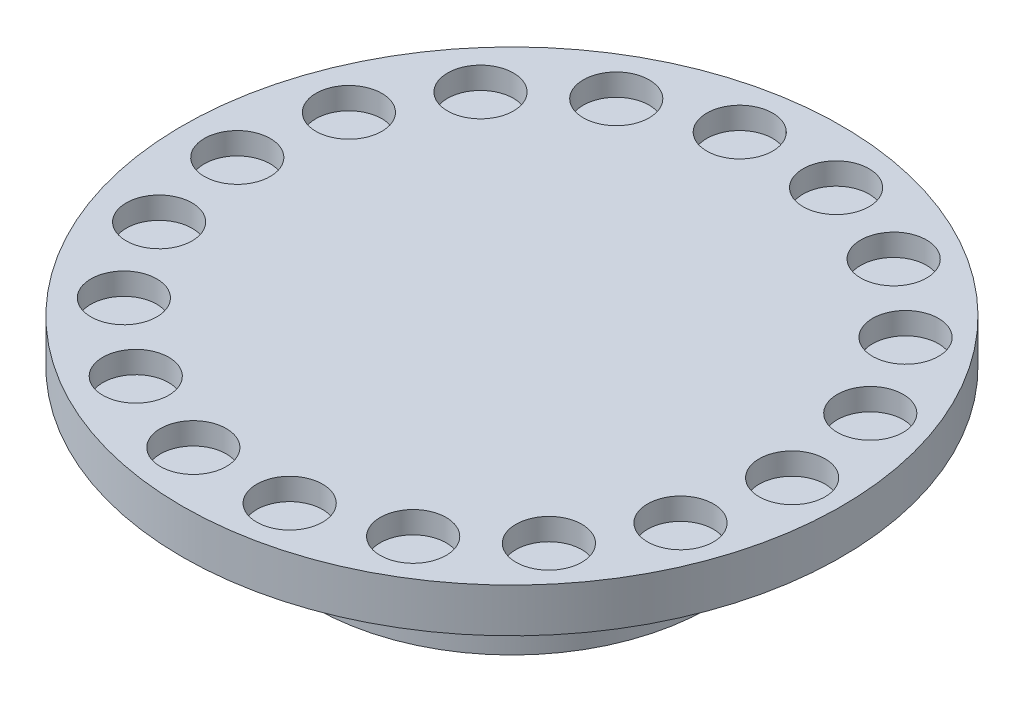
ISO-10303-21;
HEADER;
FILE_DESCRIPTION(('STEP AP214'),'2;1');
FILE_NAME('part.step','',(''),(''),'','','');
FILE_SCHEMA(('AUTOMOTIVE_DESIGN { 1 0 10303 214 1 1 1 1 }'));
ENDSEC;
DATA;
#1=APPLICATION_CONTEXT('core data for automotive mechanical design processes');
#2=APPLICATION_PROTOCOL_DEFINITION('international standard','automotive_design',2000,#1);
#3=PRODUCT_CONTEXT('',#1,'mechanical');
#4=PRODUCT('Part','Part','',(#3));
#5=PRODUCT_RELATED_PRODUCT_CATEGORY('part','',(#4));
#6=PRODUCT_DEFINITION_FORMATION('','',#4);
#7=PRODUCT_DEFINITION_CONTEXT('part definition',#1,'design');
#8=PRODUCT_DEFINITION('design','',#6,#7);
#9=PRODUCT_DEFINITION_SHAPE('','',#8);
#10=(LENGTH_UNIT() NAMED_UNIT(*) SI_UNIT(.MILLI.,.METRE.));
#11=(NAMED_UNIT(*) PLANE_ANGLE_UNIT() SI_UNIT($,.RADIAN.));
#12=(NAMED_UNIT(*) SI_UNIT($,.STERADIAN.) SOLID_ANGLE_UNIT());
#13=UNCERTAINTY_MEASURE_WITH_UNIT(LENGTH_MEASURE(1.E-05),#10,'distance_accuracy_value','');
#14=(GEOMETRIC_REPRESENTATION_CONTEXT(3) GLOBAL_UNCERTAINTY_ASSIGNED_CONTEXT((#13)) GLOBAL_UNIT_ASSIGNED_CONTEXT((#10,
#11,#12)) REPRESENTATION_CONTEXT('',''));
#15=CARTESIAN_POINT('',(0.,0.,0.));
#16=DIRECTION('',(0.,0.,1.));
#17=DIRECTION('',(1.,0.,0.));
#18=AXIS2_PLACEMENT_3D('',#15,#16,#17);
#19=CARTESIAN_POINT('',(0.,50.,0.));
#20=DIRECTION('',(0.,-1.,0.));
#21=DIRECTION('',(0.,0.,-1.));
#22=AXIS2_PLACEMENT_3D('',#19,#20,#21);
#23=CYLINDRICAL_SURFACE('',#22,90.);
#24=CARTESIAN_POINT('',(0.,50.,0.));
#25=DIRECTION('',(0.,1.,0.));
#26=DIRECTION('',(0.,0.,1.));
#27=AXIS2_PLACEMENT_3D('',#24,#25,#26);
#28=CIRCLE('',#27,90.);
#29=CARTESIAN_POINT('',(0.,50.,90.));
#30=VERTEX_POINT('',#29);
#31=EDGE_CURVE('E10',#30,#30,#28,.T.);
#32=ORIENTED_EDGE('',*,*,#31,.F.);
#33=EDGE_LOOP('',(#32));
#34=FACE_BOUND('',#33,.T.);
#35=CARTESIAN_POINT('',(0.,0.,0.));
#36=DIRECTION('',(0.,1.,0.));
#37=DIRECTION('',(0.,0.,1.));
#38=AXIS2_PLACEMENT_3D('',#35,#36,#37);
#39=CIRCLE('',#38,90.);
#40=CARTESIAN_POINT('',(0.,0.,90.));
#41=VERTEX_POINT('',#40);
#42=EDGE_CURVE('E37',#41,#41,#39,.T.);
#43=ORIENTED_EDGE('',*,*,#42,.T.);
#44=EDGE_LOOP('',(#43));
#45=FACE_BOUND('',#44,.T.);
#46=ADVANCED_FACE('F40',(#34,#45),#23,.T.);
#47=CARTESIAN_POINT('',(0.,0.,0.));
#48=DIRECTION('',(0.,1.,0.));
#49=DIRECTION('',(0.,0.,1.));
#50=AXIS2_PLACEMENT_3D('',#47,#48,#49);
#51=PLANE('',#50);
#52=CARTESIAN_POINT('',(0.,0.,0.));
#53=DIRECTION('',(0.,-1.,0.));
#54=DIRECTION('',(0.,0.,-1.));
#55=AXIS2_PLACEMENT_3D('',#52,#53,#54);
#56=CIRCLE('',#55,70.);
#57=CARTESIAN_POINT('',(0.,0.,-70.));
#58=VERTEX_POINT('',#57);
#59=EDGE_CURVE('E47',#58,#58,#56,.T.);
#60=ORIENTED_EDGE('',*,*,#59,.F.);
#61=EDGE_LOOP('',(#60));
#62=FACE_BOUND('',#61,.T.);
#63=ORIENTED_EDGE('',*,*,#42,.F.);
#64=EDGE_LOOP('',(#63));
#65=FACE_BOUND('',#64,.T.);
#66=ADVANCED_FACE('F237',(#62,#65),#51,.F.);
#67=CARTESIAN_POINT('',(0.,10.,0.));
#68=DIRECTION('',(0.,-1.,0.));
#69=DIRECTION('',(0.,0.,-1.));
#70=AXIS2_PLACEMENT_3D('',#67,#68,#69);
#71=CYLINDRICAL_SURFACE('',#70,70.);
#72=CARTESIAN_POINT('',(0.,10.,0.));
#73=DIRECTION('',(0.,-1.,0.));
#74=DIRECTION('',(0.,0.,-1.));
#75=AXIS2_PLACEMENT_3D('',#72,#73,#74);
#76=CIRCLE('',#75,70.);
#77=CARTESIAN_POINT('',(0.,10.,-70.));
#78=VERTEX_POINT('',#77);
#79=EDGE_CURVE('E50',#78,#78,#76,.T.);
#80=ORIENTED_EDGE('',*,*,#79,.F.);
#81=EDGE_LOOP('',(#80));
#82=FACE_BOUND('',#81,.T.);
#83=ORIENTED_EDGE('',*,*,#59,.T.);
#84=EDGE_LOOP('',(#83));
#85=FACE_BOUND('',#84,.T.);
#86=ADVANCED_FACE('F242',(#82,#85),#71,.F.);
#87=CARTESIAN_POINT('',(0.,10.,0.));
#88=DIRECTION('',(0.,-1.,0.));
#89=DIRECTION('',(0.,0.,-1.));
#90=AXIS2_PLACEMENT_3D('',#87,#88,#89);
#91=PLANE('',#90);
#92=ORIENTED_EDGE('',*,*,#79,.T.);
#93=EDGE_LOOP('',(#92));
#94=FACE_BOUND('',#93,.T.);
#95=ADVANCED_FACE('F225',(#94),#91,.T.);
#96=CARTESIAN_POINT('',(0.,70.,0.));
#97=DIRECTION('',(0.,-1.,0.));
#98=DIRECTION('',(0.,0.,-1.));
#99=AXIS2_PLACEMENT_3D('',#96,#97,#98);
#100=CYLINDRICAL_SURFACE('',#99,150.);
#101=CARTESIAN_POINT('',(0.,70.,0.));
#102=DIRECTION('',(0.,1.,0.));
#103=DIRECTION('',(0.,0.,1.));
#104=AXIS2_PLACEMENT_3D('',#101,#102,#103);
#105=CIRCLE('',#104,150.);
#106=CARTESIAN_POINT('',(0.,70.,150.));
#107=VERTEX_POINT('',#106);
#108=EDGE_CURVE('E55',#107,#107,#105,.T.);
#109=ORIENTED_EDGE('',*,*,#108,.F.);
#110=EDGE_LOOP('',(#109));
#111=FACE_BOUND('',#110,.T.);
#112=CARTESIAN_POINT('',(0.,50.,0.));
#113=DIRECTION('',(0.,1.,0.));
#114=DIRECTION('',(0.,0.,1.));
#115=AXIS2_PLACEMENT_3D('',#112,#113,#114);
#116=CIRCLE('',#115,150.);
#117=CARTESIAN_POINT('',(0.,50.,150.));
#118=VERTEX_POINT('',#117);
#119=EDGE_CURVE('E54',#118,#118,#116,.T.);
#120=ORIENTED_EDGE('',*,*,#119,.T.);
#121=EDGE_LOOP('',(#120));
#122=FACE_BOUND('',#121,.T.);
#123=ADVANCED_FACE('F185',(#111,#122),#100,.T.);
#124=CARTESIAN_POINT('',(0.,70.,0.));
#125=DIRECTION('',(0.,1.,0.));
#126=DIRECTION('',(0.,0.,1.));
#127=AXIS2_PLACEMENT_3D('',#124,#125,#126);
#128=PLANE('',#127);
#129=CARTESIAN_POINT('',(-95.4601569594668,70.,81.1600517280985));
#130=DIRECTION('',(0.,1.,0.));
#131=DIRECTION('',(0.64278760968654,0.,0.766044443118977));
#132=AXIS2_PLACEMENT_3D('',#129,#130,#131);
#133=CIRCLE('',#132,15.);
#134=CARTESIAN_POINT('',(-85.8183428141687,70.,92.6507183748832));
#135=VERTEX_POINT('',#134);
#136=EDGE_CURVE('E162',#135,#135,#133,.T.);
#137=ORIENTED_EDGE('',*,*,#136,.F.);
#138=EDGE_LOOP('',(#137));
#139=FACE_BOUND('',#138,.T.);
#140=CARTESIAN_POINT('',(-61.8686868686867,70.,109.346641891975));
#141=DIRECTION('',(0.,1.,0.));
#142=DIRECTION('',(0.86602540378444,0.,0.499999999999998));
#143=AXIS2_PLACEMENT_3D('',#140,#141,#142);
#144=CIRCLE('',#143,15.);
#145=CARTESIAN_POINT('',(-48.8783058119201,70.,116.846641891975));
#146=VERTEX_POINT('',#145);
#147=EDGE_CURVE('E160',#146,#146,#144,.T.);
#148=ORIENTED_EDGE('',*,*,#147,.F.);
#149=EDGE_LOOP('',(#148));
#150=FACE_BOUND('',#149,.T.);
#151=CARTESIAN_POINT('',(-20.6626486953192,70.,124.344413259117));
#152=DIRECTION('',(0.,1.,0.));
#153=DIRECTION('',(0.984807753012209,0.,0.173648177666928));
#154=AXIS2_PLACEMENT_3D('',#151,#152,#153);
#155=CIRCLE('',#154,15.);
#156=CARTESIAN_POINT('',(-5.89053240013604,70.,126.949135924121));
#157=VERTEX_POINT('',#156);
#158=EDGE_CURVE('E151',#157,#157,#155,.T.);
#159=ORIENTED_EDGE('',*,*,#158,.F.);
#160=EDGE_LOOP('',(#159));
#161=FACE_BOUND('',#160,.T.);
#162=CARTESIAN_POINT('',(23.1879012205724,70.,124.344413259117));
#163=DIRECTION('',(0.,1.,0.));
#164=DIRECTION('',(0.984807753012207,0.,-0.173648177666934));
#165=AXIS2_PLACEMENT_3D('',#162,#163,#164);
#166=CIRCLE('',#165,15.);
#167=CARTESIAN_POINT('',(37.9600175157555,70.,121.739690594113));
#168=VERTEX_POINT('',#167);
#169=EDGE_CURVE('E144',#168,#168,#166,.T.);
#170=ORIENTED_EDGE('',*,*,#169,.F.);
#171=EDGE_LOOP('',(#170));
#172=FACE_BOUND('',#171,.T.);
#173=CARTESIAN_POINT('',(64.3939393939398,70.,109.346641891974));
#174=DIRECTION('',(0.,1.,0.));
#175=DIRECTION('',(0.866025403784437,0.,-0.500000000000004));
#176=AXIS2_PLACEMENT_3D('',#173,#174,#175);
#177=CIRCLE('',#176,15.);
#178=CARTESIAN_POINT('',(77.3843204507064,70.,101.846641891974));
#179=VERTEX_POINT('',#178);
#180=EDGE_CURVE('E139',#179,#179,#177,.T.);
#181=ORIENTED_EDGE('',*,*,#180,.F.);
#182=EDGE_LOOP('',(#181));
#183=FACE_BOUND('',#182,.T.);
#184=CARTESIAN_POINT('',(97.9854094847198,70.,81.1600517280979));
#185=DIRECTION('',(0.,1.,0.));
#186=DIRECTION('',(0.642787609686535,0.,-0.766044443118981));
#187=AXIS2_PLACEMENT_3D('',#184,#185,#186);
#188=CIRCLE('',#187,15.);
#189=CARTESIAN_POINT('',(107.627223630018,70.,69.6693850813132));
#190=VERTEX_POINT('',#189);
#191=EDGE_CURVE('E134',#190,#190,#188,.T.);
#192=ORIENTED_EDGE('',*,*,#191,.F.);
#193=EDGE_LOOP('',(#192));
#194=FACE_BOUND('',#193,.T.);
#195=CARTESIAN_POINT('',(119.910684442665,70.,43.1843615310182));
#196=DIRECTION('',(0.,1.,0.));
#197=DIRECTION('',(0.342020143325663,0.,-0.93969262078591));
#198=AXIS2_PLACEMENT_3D('',#195,#196,#197);
#199=CIRCLE('',#198,15.);
#200=CARTESIAN_POINT('',(125.04098659255,70.,29.0889722192295));
#201=VERTEX_POINT('',#200);
#202=EDGE_CURVE('E130',#201,#201,#199,.T.);
#203=ORIENTED_EDGE('',*,*,#202,.F.);
#204=EDGE_LOOP('',(#203));
#205=FACE_BOUND('',#204,.T.);
#206=CARTESIAN_POINT('',(127.525252525253,70.,-7.21514374330028E-13));
#207=DIRECTION('',(0.,1.,0.));
#208=DIRECTION('',(0.,0.,-1.));
#209=AXIS2_PLACEMENT_3D('',#206,#207,#208);
#210=CIRCLE('',#209,15.);
#211=CARTESIAN_POINT('',(127.525252525252,70.,-15.0000000000007));
#212=VERTEX_POINT('',#211);
#213=EDGE_CURVE('E123',#212,#212,#210,.T.);
#214=ORIENTED_EDGE('',*,*,#213,.F.);
#215=EDGE_LOOP('',(#214));
#216=FACE_BOUND('',#215,.T.);
#217=CARTESIAN_POINT('',(119.910684442665,70.,-43.1843615310196));
#218=DIRECTION('',(0.,1.,0.));
#219=DIRECTION('',(-0.342020143325675,0.,-0.939692620785906));
#220=AXIS2_PLACEMENT_3D('',#217,#218,#219);
#221=CIRCLE('',#220,15.);
#222=CARTESIAN_POINT('',(114.78038229278,70.,-57.2797508428082));
#223=VERTEX_POINT('',#222);
#224=EDGE_CURVE('E113',#223,#223,#221,.T.);
#225=ORIENTED_EDGE('',*,*,#224,.F.);
#226=EDGE_LOOP('',(#225));
#227=FACE_BOUND('',#226,.T.);
#228=CARTESIAN_POINT('',(97.9854094847188,70.,-81.1600517280991));
#229=DIRECTION('',(0.,1.,0.));
#230=DIRECTION('',(-0.642787609686545,0.,-0.766044443118973));
#231=AXIS2_PLACEMENT_3D('',#228,#229,#230);
#232=CIRCLE('',#231,15.);
#233=CARTESIAN_POINT('',(88.3435953394206,70.,-92.6507183748837));
#234=VERTEX_POINT('',#233);
#235=EDGE_CURVE('E108',#234,#234,#232,.T.);
#236=ORIENTED_EDGE('',*,*,#235,.F.);
#237=EDGE_LOOP('',(#236));
#238=FACE_BOUND('',#237,.T.);
#239=CARTESIAN_POINT('',(64.3939393939385,70.,-109.346641891975));
#240=DIRECTION('',(0.,1.,0.));
#241=DIRECTION('',(-0.866025403784443,0.,-0.499999999999993));
#242=AXIS2_PLACEMENT_3D('',#239,#240,#241);
#243=CIRCLE('',#242,15.);
#244=CARTESIAN_POINT('',(51.4035583371719,70.,-116.846641891975));
#245=VERTEX_POINT('',#244);
#246=EDGE_CURVE('E103',#245,#245,#243,.T.);
#247=ORIENTED_EDGE('',*,*,#246,.F.);
#248=EDGE_LOOP('',(#247));
#249=FACE_BOUND('',#248,.T.);
#250=CARTESIAN_POINT('',(23.1879012205709,70.,-124.344413259117));
#251=DIRECTION('',(0.,1.,0.));
#252=DIRECTION('',(-0.98480775301221,0.,-0.173648177666922));
#253=AXIS2_PLACEMENT_3D('',#250,#251,#252);
#254=CIRCLE('',#253,15.);
#255=CARTESIAN_POINT('',(8.41578492538779,70.,-126.949135924121));
#256=VERTEX_POINT('',#255);
#257=EDGE_CURVE('E100',#256,#256,#254,.T.);
#258=ORIENTED_EDGE('',*,*,#257,.F.);
#259=EDGE_LOOP('',(#258));
#260=FACE_BOUND('',#259,.T.);
#261=CARTESIAN_POINT('',(-20.6626486953207,70.,-124.344413259117));
#262=DIRECTION('',(0.,1.,0.));
#263=DIRECTION('',(-0.984807753012206,0.,0.17364817766694));
#264=AXIS2_PLACEMENT_3D('',#261,#262,#263);
#265=CIRCLE('',#264,15.);
#266=CARTESIAN_POINT('',(-35.4347649905038,70.,-121.739690594113));
#267=VERTEX_POINT('',#266);
#268=EDGE_CURVE('E93',#267,#267,#265,.T.);
#269=ORIENTED_EDGE('',*,*,#268,.F.);
#270=EDGE_LOOP('',(#269));
#271=FACE_BOUND('',#270,.T.);
#272=CARTESIAN_POINT('',(-61.868686868688,70.,-109.346641891974));
#273=DIRECTION('',(0.,1.,0.));
#274=DIRECTION('',(-0.866025403784433,0.,0.500000000000009));
#275=AXIS2_PLACEMENT_3D('',#272,#273,#274);
#276=CIRCLE('',#275,15.);
#277=CARTESIAN_POINT('',(-74.8590679254545,70.,-101.846641891974));
#278=VERTEX_POINT('',#277);
#279=EDGE_CURVE('E82',#278,#278,#276,.T.);
#280=ORIENTED_EDGE('',*,*,#279,.F.);
#281=EDGE_LOOP('',(#280));
#282=FACE_BOUND('',#281,.T.);
#283=CARTESIAN_POINT('',(-95.4601569594678,70.,-81.1600517280973));
#284=DIRECTION('',(0.,1.,0.));
#285=DIRECTION('',(-0.642787609686531,0.,0.766044443118985));
#286=AXIS2_PLACEMENT_3D('',#283,#284,#285);
#287=CIRCLE('',#286,15.);
#288=CARTESIAN_POINT('',(-105.101971104766,70.,-69.6693850813125));
#289=VERTEX_POINT('',#288);
#290=EDGE_CURVE('E76',#289,#289,#287,.T.);
#291=ORIENTED_EDGE('',*,*,#290,.F.);
#292=EDGE_LOOP('',(#291));
#293=FACE_BOUND('',#292,.T.);
#294=CARTESIAN_POINT('',(-117.385431917413,70.,-43.1843615310174));
#295=DIRECTION('',(0.,1.,0.));
#296=DIRECTION('',(-0.342020143325658,0.,0.939692620785912));
#297=AXIS2_PLACEMENT_3D('',#294,#295,#296);
#298=CIRCLE('',#297,15.);
#299=CARTESIAN_POINT('',(-122.515734067298,70.,-29.0889722192287));
#300=VERTEX_POINT('',#299);
#301=EDGE_CURVE('E71',#300,#300,#298,.T.);
#302=ORIENTED_EDGE('',*,*,#301,.F.);
#303=EDGE_LOOP('',(#302));
#304=FACE_BOUND('',#303,.T.);
#305=CARTESIAN_POINT('',(-117.385431917413,70.,43.1843615310189));
#306=DIRECTION('',(0.,1.,0.));
#307=DIRECTION('',(0.342020143325669,0.,0.939692620785908));
#308=AXIS2_PLACEMENT_3D('',#305,#306,#307);
#309=CIRCLE('',#308,15.);
#310=CARTESIAN_POINT('',(-112.255129767528,70.,57.2797508428075));
#311=VERTEX_POINT('',#310);
#312=EDGE_CURVE('E70',#311,#311,#309,.T.);
#313=ORIENTED_EDGE('',*,*,#312,.F.);
#314=EDGE_LOOP('',(#313));
#315=FACE_BOUND('',#314,.T.);
#316=CARTESIAN_POINT('',(-125.,70.,0.));
#317=DIRECTION('',(0.,1.,0.));
#318=DIRECTION('',(0.,0.,1.));
#319=AXIS2_PLACEMENT_3D('',#316,#317,#318);
#320=CIRCLE('',#319,15.);
#321=CARTESIAN_POINT('',(-125.,70.,15.));
#322=VERTEX_POINT('',#321);
#323=EDGE_CURVE('E62',#322,#322,#320,.T.);
#324=ORIENTED_EDGE('',*,*,#323,.F.);
#325=EDGE_LOOP('',(#324));
#326=FACE_BOUND('',#325,.T.);
#327=ORIENTED_EDGE('',*,*,#108,.T.);
#328=EDGE_LOOP('',(#327));
#329=FACE_BOUND('',#328,.T.);
#330=ADVANCED_FACE('F176',(#139,#150,#161,#172,#183,#194,#205,#216,#227,#238,#249,#260,#271,
#282,#293,#304,#315,#326,#329),#128,.T.);
#331=CARTESIAN_POINT('',(0.,50.,0.));
#332=DIRECTION('',(0.,1.,0.));
#333=DIRECTION('',(0.,0.,1.));
#334=AXIS2_PLACEMENT_3D('',#331,#332,#333);
#335=PLANE('',#334);
#336=ORIENTED_EDGE('',*,*,#31,.T.);
#337=EDGE_LOOP('',(#336));
#338=FACE_BOUND('',#337,.T.);
#339=ORIENTED_EDGE('',*,*,#119,.F.);
#340=EDGE_LOOP('',(#339));
#341=FACE_BOUND('',#340,.T.);
#342=ADVANCED_FACE('F182',(#338,#341),#335,.F.);
#343=CARTESIAN_POINT('',(-125.,60.,0.));
#344=DIRECTION('',(0.,1.,0.));
#345=DIRECTION('',(0.,0.,1.));
#346=AXIS2_PLACEMENT_3D('',#343,#344,#345);
#347=CYLINDRICAL_SURFACE('',#346,15.);
#348=CARTESIAN_POINT('',(-125.,60.,0.));
#349=DIRECTION('',(0.,1.,0.));
#350=DIRECTION('',(0.,0.,1.));
#351=AXIS2_PLACEMENT_3D('',#348,#349,#350);
#352=CIRCLE('',#351,15.);
#353=CARTESIAN_POINT('',(-125.,60.,15.));
#354=VERTEX_POINT('',#353);
#355=EDGE_CURVE('E59',#354,#354,#352,.T.);
#356=ORIENTED_EDGE('',*,*,#355,.F.);
#357=EDGE_LOOP('',(#356));
#358=FACE_BOUND('',#357,.T.);
#359=ORIENTED_EDGE('',*,*,#323,.T.);
#360=EDGE_LOOP('',(#359));
#361=FACE_BOUND('',#360,.T.);
#362=ADVANCED_FACE('F230',(#358,#361),#347,.F.);
#363=CARTESIAN_POINT('',(-125.,60.,0.));
#364=DIRECTION('',(0.,1.,0.));
#365=DIRECTION('',(0.,0.,1.));
#366=AXIS2_PLACEMENT_3D('',#363,#364,#365);
#367=PLANE('',#366);
#368=ORIENTED_EDGE('',*,*,#355,.T.);
#369=EDGE_LOOP('',(#368));
#370=FACE_BOUND('',#369,.T.);
#371=ADVANCED_FACE('F235',(#370),#367,.T.);
#372=CARTESIAN_POINT('',(-117.385431917413,60.,43.1843615310189));
#373=DIRECTION('',(0.,1.,0.));
#374=DIRECTION('',(0.,0.,1.));
#375=AXIS2_PLACEMENT_3D('',#372,#373,#374);
#376=CYLINDRICAL_SURFACE('',#375,15.);
#377=CARTESIAN_POINT('',(-117.385431917413,60.,43.1843615310189));
#378=DIRECTION('',(0.,1.,0.));
#379=DIRECTION('',(0.342020143325669,0.,0.939692620785908));
#380=AXIS2_PLACEMENT_3D('',#377,#378,#379);
#381=CIRCLE('',#380,15.);
#382=CARTESIAN_POINT('',(-112.255129767528,60.,57.2797508428075));
#383=VERTEX_POINT('',#382);
#384=EDGE_CURVE('E61',#383,#383,#381,.T.);
#385=ORIENTED_EDGE('',*,*,#384,.F.);
#386=EDGE_LOOP('',(#385));
#387=FACE_BOUND('',#386,.T.);
#388=ORIENTED_EDGE('',*,*,#312,.T.);
#389=EDGE_LOOP('',(#388));
#390=FACE_BOUND('',#389,.T.);
#391=ADVANCED_FACE('F291',(#387,#390),#376,.F.);
#392=CARTESIAN_POINT('',(-117.385431917413,60.,43.1843615310189));
#393=DIRECTION('',(0.,1.,0.));
#394=DIRECTION('',(0.342020143325669,0.,0.939692620785908));
#395=AXIS2_PLACEMENT_3D('',#392,#393,#394);
#396=PLANE('',#395);
#397=ORIENTED_EDGE('',*,*,#384,.T.);
#398=EDGE_LOOP('',(#397));
#399=FACE_BOUND('',#398,.T.);
#400=ADVANCED_FACE('F305',(#399),#396,.T.);
#401=CARTESIAN_POINT('',(-117.385431917413,60.,-43.1843615310174));
#402=DIRECTION('',(0.,1.,0.));
#403=DIRECTION('',(0.,0.,1.));
#404=AXIS2_PLACEMENT_3D('',#401,#402,#403);
#405=CYLINDRICAL_SURFACE('',#404,15.);
#406=CARTESIAN_POINT('',(-117.385431917413,60.,-43.1843615310174));
#407=DIRECTION('',(0.,1.,0.));
#408=DIRECTION('',(-0.342020143325658,0.,0.939692620785912));
#409=AXIS2_PLACEMENT_3D('',#406,#407,#408);
#410=CIRCLE('',#409,15.);
#411=CARTESIAN_POINT('',(-122.515734067298,60.,-29.0889722192287));
#412=VERTEX_POINT('',#411);
#413=EDGE_CURVE('E77',#412,#412,#410,.T.);
#414=ORIENTED_EDGE('',*,*,#413,.F.);
#415=EDGE_LOOP('',(#414));
#416=FACE_BOUND('',#415,.T.);
#417=ORIENTED_EDGE('',*,*,#301,.T.);
#418=EDGE_LOOP('',(#417));
#419=FACE_BOUND('',#418,.T.);
#420=ADVANCED_FACE('F315',(#416,#419),#405,.F.);
#421=CARTESIAN_POINT('',(-117.385431917413,60.,-43.1843615310174));
#422=DIRECTION('',(0.,1.,0.));
#423=DIRECTION('',(-0.342020143325658,0.,0.939692620785912));
#424=AXIS2_PLACEMENT_3D('',#421,#422,#423);
#425=PLANE('',#424);
#426=ORIENTED_EDGE('',*,*,#413,.T.);
#427=EDGE_LOOP('',(#426));
#428=FACE_BOUND('',#427,.T.);
#429=ADVANCED_FACE('F325',(#428),#425,.T.);
#430=CARTESIAN_POINT('',(-95.4601569594678,60.,-81.1600517280973));
#431=DIRECTION('',(0.,1.,0.));
#432=DIRECTION('',(0.,0.,1.));
#433=AXIS2_PLACEMENT_3D('',#430,#431,#432);
#434=CYLINDRICAL_SURFACE('',#433,15.);
#435=CARTESIAN_POINT('',(-95.4601569594678,60.,-81.1600517280973));
#436=DIRECTION('',(0.,1.,0.));
#437=DIRECTION('',(-0.642787609686531,0.,0.766044443118985));
#438=AXIS2_PLACEMENT_3D('',#435,#436,#437);
#439=CIRCLE('',#438,15.);
#440=CARTESIAN_POINT('',(-105.101971104766,60.,-69.6693850813125));
#441=VERTEX_POINT('',#440);
#442=EDGE_CURVE('E85',#441,#441,#439,.T.);
#443=ORIENTED_EDGE('',*,*,#442,.F.);
#444=EDGE_LOOP('',(#443));
#445=FACE_BOUND('',#444,.T.);
#446=ORIENTED_EDGE('',*,*,#290,.T.);
#447=EDGE_LOOP('',(#446));
#448=FACE_BOUND('',#447,.T.);
#449=ADVANCED_FACE('F335',(#445,#448),#434,.F.);
#450=CARTESIAN_POINT('',(-95.4601569594678,60.,-81.1600517280973));
#451=DIRECTION('',(0.,1.,0.));
#452=DIRECTION('',(-0.642787609686531,0.,0.766044443118985));
#453=AXIS2_PLACEMENT_3D('',#450,#451,#452);
#454=PLANE('',#453);
#455=ORIENTED_EDGE('',*,*,#442,.T.);
#456=EDGE_LOOP('',(#455));
#457=FACE_BOUND('',#456,.T.);
#458=ADVANCED_FACE('F345',(#457),#454,.T.);
#459=CARTESIAN_POINT('',(-61.868686868688,60.,-109.346641891974));
#460=DIRECTION('',(0.,1.,0.));
#461=DIRECTION('',(0.,0.,1.));
#462=AXIS2_PLACEMENT_3D('',#459,#460,#461);
#463=CYLINDRICAL_SURFACE('',#462,15.);
#464=CARTESIAN_POINT('',(-61.868686868688,60.,-109.346641891974));
#465=DIRECTION('',(0.,1.,0.));
#466=DIRECTION('',(-0.866025403784433,0.,0.500000000000009));
#467=AXIS2_PLACEMENT_3D('',#464,#465,#466);
#468=CIRCLE('',#467,15.);
#469=CARTESIAN_POINT('',(-74.8590679254545,60.,-101.846641891974));
#470=VERTEX_POINT('',#469);
#471=EDGE_CURVE('E86',#470,#470,#468,.T.);
#472=ORIENTED_EDGE('',*,*,#471,.F.);
#473=EDGE_LOOP('',(#472));
#474=FACE_BOUND('',#473,.T.);
#475=ORIENTED_EDGE('',*,*,#279,.T.);
#476=EDGE_LOOP('',(#475));
#477=FACE_BOUND('',#476,.T.);
#478=ADVANCED_FACE('F355',(#474,#477),#463,.F.);
#479=CARTESIAN_POINT('',(-61.868686868688,60.,-109.346641891974));
#480=DIRECTION('',(0.,1.,0.));
#481=DIRECTION('',(-0.866025403784433,0.,0.500000000000009));
#482=AXIS2_PLACEMENT_3D('',#479,#480,#481);
#483=PLANE('',#482);
#484=ORIENTED_EDGE('',*,*,#471,.T.);
#485=EDGE_LOOP('',(#484));
#486=FACE_BOUND('',#485,.T.);
#487=ADVANCED_FACE('F362',(#486),#483,.T.);
#488=CARTESIAN_POINT('',(-20.6626486953207,60.,-124.344413259117));
#489=DIRECTION('',(0.,1.,0.));
#490=DIRECTION('',(0.,0.,1.));
#491=AXIS2_PLACEMENT_3D('',#488,#489,#490);
#492=CYLINDRICAL_SURFACE('',#491,15.);
#493=CARTESIAN_POINT('',(-20.6626486953207,60.,-124.344413259117));
#494=DIRECTION('',(0.,1.,0.));
#495=DIRECTION('',(-0.984807753012206,0.,0.17364817766694));
#496=AXIS2_PLACEMENT_3D('',#493,#494,#495);
#497=CIRCLE('',#496,15.);
#498=CARTESIAN_POINT('',(-35.4347649905038,60.,-121.739690594113));
#499=VERTEX_POINT('',#498);
#500=EDGE_CURVE('E94',#499,#499,#497,.T.);
#501=ORIENTED_EDGE('',*,*,#500,.F.);
#502=EDGE_LOOP('',(#501));
#503=FACE_BOUND('',#502,.T.);
#504=ORIENTED_EDGE('',*,*,#268,.T.);
#505=EDGE_LOOP('',(#504));
#506=FACE_BOUND('',#505,.T.);
#507=ADVANCED_FACE('F375',(#503,#506),#492,.F.);
#508=CARTESIAN_POINT('',(-20.6626486953207,60.,-124.344413259117));
#509=DIRECTION('',(0.,1.,0.));
#510=DIRECTION('',(-0.984807753012206,0.,0.17364817766694));
#511=AXIS2_PLACEMENT_3D('',#508,#509,#510);
#512=PLANE('',#511);
#513=ORIENTED_EDGE('',*,*,#500,.T.);
#514=EDGE_LOOP('',(#513));
#515=FACE_BOUND('',#514,.T.);
#516=ADVANCED_FACE('F385',(#515),#512,.T.);
#517=CARTESIAN_POINT('',(23.1879012205709,60.,-124.344413259117));
#518=DIRECTION('',(0.,1.,0.));
#519=DIRECTION('',(0.,0.,1.));
#520=AXIS2_PLACEMENT_3D('',#517,#518,#519);
#521=CYLINDRICAL_SURFACE('',#520,15.);
#522=CARTESIAN_POINT('',(23.1879012205709,60.,-124.344413259117));
#523=DIRECTION('',(0.,1.,0.));
#524=DIRECTION('',(-0.98480775301221,0.,-0.173648177666922));
#525=AXIS2_PLACEMENT_3D('',#522,#523,#524);
#526=CIRCLE('',#525,15.);
#527=CARTESIAN_POINT('',(8.41578492538779,60.,-126.949135924121));
#528=VERTEX_POINT('',#527);
#529=EDGE_CURVE('E99',#528,#528,#526,.T.);
#530=ORIENTED_EDGE('',*,*,#529,.F.);
#531=EDGE_LOOP('',(#530));
#532=FACE_BOUND('',#531,.T.);
#533=ORIENTED_EDGE('',*,*,#257,.T.);
#534=EDGE_LOOP('',(#533));
#535=FACE_BOUND('',#534,.T.);
#536=ADVANCED_FACE('F395',(#532,#535),#521,.F.);
#537=CARTESIAN_POINT('',(23.1879012205709,60.,-124.344413259117));
#538=DIRECTION('',(0.,1.,0.));
#539=DIRECTION('',(-0.98480775301221,0.,-0.173648177666922));
#540=AXIS2_PLACEMENT_3D('',#537,#538,#539);
#541=PLANE('',#540);
#542=ORIENTED_EDGE('',*,*,#529,.T.);
#543=EDGE_LOOP('',(#542));
#544=FACE_BOUND('',#543,.T.);
#545=ADVANCED_FACE('F405',(#544),#541,.T.);
#546=CARTESIAN_POINT('',(64.3939393939385,60.,-109.346641891975));
#547=DIRECTION('',(0.,1.,0.));
#548=DIRECTION('',(0.,0.,1.));
#549=AXIS2_PLACEMENT_3D('',#546,#547,#548);
#550=CYLINDRICAL_SURFACE('',#549,15.);
#551=CARTESIAN_POINT('',(64.3939393939385,60.,-109.346641891975));
#552=DIRECTION('',(0.,1.,0.));
#553=DIRECTION('',(-0.866025403784443,0.,-0.499999999999993));
#554=AXIS2_PLACEMENT_3D('',#551,#552,#553);
#555=CIRCLE('',#554,15.);
#556=CARTESIAN_POINT('',(51.4035583371719,60.,-116.846641891975));
#557=VERTEX_POINT('',#556);
#558=EDGE_CURVE('E106',#557,#557,#555,.T.);
#559=ORIENTED_EDGE('',*,*,#558,.F.);
#560=EDGE_LOOP('',(#559));
#561=FACE_BOUND('',#560,.T.);
#562=ORIENTED_EDGE('',*,*,#246,.T.);
#563=EDGE_LOOP('',(#562));
#564=FACE_BOUND('',#563,.T.);
#565=ADVANCED_FACE('F415',(#561,#564),#550,.F.);
#566=CARTESIAN_POINT('',(64.3939393939385,60.,-109.346641891975));
#567=DIRECTION('',(0.,1.,0.));
#568=DIRECTION('',(-0.866025403784443,0.,-0.499999999999993));
#569=AXIS2_PLACEMENT_3D('',#566,#567,#568);
#570=PLANE('',#569);
#571=ORIENTED_EDGE('',*,*,#558,.T.);
#572=EDGE_LOOP('',(#571));
#573=FACE_BOUND('',#572,.T.);
#574=ADVANCED_FACE('F425',(#573),#570,.T.);
#575=CARTESIAN_POINT('',(97.9854094847188,60.,-81.1600517280991));
#576=DIRECTION('',(0.,1.,0.));
#577=DIRECTION('',(0.,0.,1.));
#578=AXIS2_PLACEMENT_3D('',#575,#576,#577);
#579=CYLINDRICAL_SURFACE('',#578,15.);
#580=CARTESIAN_POINT('',(97.9854094847188,60.,-81.1600517280991));
#581=DIRECTION('',(0.,1.,0.));
#582=DIRECTION('',(-0.642787609686545,0.,-0.766044443118973));
#583=AXIS2_PLACEMENT_3D('',#580,#581,#582);
#584=CIRCLE('',#583,15.);
#585=CARTESIAN_POINT('',(88.3435953394206,60.,-92.6507183748837));
#586=VERTEX_POINT('',#585);
#587=EDGE_CURVE('E115',#586,#586,#584,.T.);
#588=ORIENTED_EDGE('',*,*,#587,.F.);
#589=EDGE_LOOP('',(#588));
#590=FACE_BOUND('',#589,.T.);
#591=ORIENTED_EDGE('',*,*,#235,.T.);
#592=EDGE_LOOP('',(#591));
#593=FACE_BOUND('',#592,.T.);
#594=ADVANCED_FACE('F435',(#590,#593),#579,.F.);
#595=CARTESIAN_POINT('',(97.9854094847188,60.,-81.1600517280991));
#596=DIRECTION('',(0.,1.,0.));
#597=DIRECTION('',(-0.642787609686545,0.,-0.766044443118973));
#598=AXIS2_PLACEMENT_3D('',#595,#596,#597);
#599=PLANE('',#598);
#600=ORIENTED_EDGE('',*,*,#587,.T.);
#601=EDGE_LOOP('',(#600));
#602=FACE_BOUND('',#601,.T.);
#603=ADVANCED_FACE('F445',(#602),#599,.T.);
#604=CARTESIAN_POINT('',(119.910684442665,60.,-43.1843615310196));
#605=DIRECTION('',(0.,1.,0.));
#606=DIRECTION('',(0.,0.,1.));
#607=AXIS2_PLACEMENT_3D('',#604,#605,#606);
#608=CYLINDRICAL_SURFACE('',#607,15.);
#609=CARTESIAN_POINT('',(119.910684442665,60.,-43.1843615310196));
#610=DIRECTION('',(0.,1.,0.));
#611=DIRECTION('',(-0.342020143325675,0.,-0.939692620785906));
#612=AXIS2_PLACEMENT_3D('',#609,#610,#611);
#613=CIRCLE('',#612,15.);
#614=CARTESIAN_POINT('',(114.78038229278,60.,-57.2797508428082));
#615=VERTEX_POINT('',#614);
#616=EDGE_CURVE('E119',#615,#615,#613,.T.);
#617=ORIENTED_EDGE('',*,*,#616,.F.);
#618=EDGE_LOOP('',(#617));
#619=FACE_BOUND('',#618,.T.);
#620=ORIENTED_EDGE('',*,*,#224,.T.);
#621=EDGE_LOOP('',(#620));
#622=FACE_BOUND('',#621,.T.);
#623=ADVANCED_FACE('F455',(#619,#622),#608,.F.);
#624=CARTESIAN_POINT('',(119.910684442665,60.,-43.1843615310196));
#625=DIRECTION('',(0.,1.,0.));
#626=DIRECTION('',(-0.342020143325675,0.,-0.939692620785906));
#627=AXIS2_PLACEMENT_3D('',#624,#625,#626);
#628=PLANE('',#627);
#629=ORIENTED_EDGE('',*,*,#616,.T.);
#630=EDGE_LOOP('',(#629));
#631=FACE_BOUND('',#630,.T.);
#632=ADVANCED_FACE('F465',(#631),#628,.T.);
#633=CARTESIAN_POINT('',(127.525252525253,60.,-7.21514374330028E-13));
#634=DIRECTION('',(0.,1.,0.));
#635=DIRECTION('',(0.,0.,1.));
#636=AXIS2_PLACEMENT_3D('',#633,#634,#635);
#637=CYLINDRICAL_SURFACE('',#636,15.);
#638=CARTESIAN_POINT('',(127.525252525253,60.,-7.21514374330028E-13));
#639=DIRECTION('',(0.,1.,0.));
#640=DIRECTION('',(0.,0.,-1.));
#641=AXIS2_PLACEMENT_3D('',#638,#639,#640);
#642=CIRCLE('',#641,15.);
#643=CARTESIAN_POINT('',(127.525252525252,60.,-15.0000000000007));
#644=VERTEX_POINT('',#643);
#645=EDGE_CURVE('E124',#644,#644,#642,.T.);
#646=ORIENTED_EDGE('',*,*,#645,.F.);
#647=EDGE_LOOP('',(#646));
#648=FACE_BOUND('',#647,.T.);
#649=ORIENTED_EDGE('',*,*,#213,.T.);
#650=EDGE_LOOP('',(#649));
#651=FACE_BOUND('',#650,.T.);
#652=ADVANCED_FACE('F472',(#648,#651),#637,.F.);
#653=CARTESIAN_POINT('',(127.525252525253,60.,-7.21514374330028E-13));
#654=DIRECTION('',(0.,1.,0.));
#655=DIRECTION('',(0.,0.,-1.));
#656=AXIS2_PLACEMENT_3D('',#653,#654,#655);
#657=PLANE('',#656);
#658=ORIENTED_EDGE('',*,*,#645,.T.);
#659=EDGE_LOOP('',(#658));
#660=FACE_BOUND('',#659,.T.);
#661=ADVANCED_FACE('F485',(#660),#657,.T.);
#662=CARTESIAN_POINT('',(119.910684442665,60.,43.1843615310182));
#663=DIRECTION('',(0.,1.,0.));
#664=DIRECTION('',(0.,0.,1.));
#665=AXIS2_PLACEMENT_3D('',#662,#663,#664);
#666=CYLINDRICAL_SURFACE('',#665,15.);
#667=CARTESIAN_POINT('',(119.910684442665,60.,43.1843615310182));
#668=DIRECTION('',(0.,1.,0.));
#669=DIRECTION('',(0.342020143325663,0.,-0.93969262078591));
#670=AXIS2_PLACEMENT_3D('',#667,#668,#669);
#671=CIRCLE('',#670,15.);
#672=CARTESIAN_POINT('',(125.04098659255,60.,29.0889722192295));
#673=VERTEX_POINT('',#672);
#674=EDGE_CURVE('E128',#673,#673,#671,.T.);
#675=ORIENTED_EDGE('',*,*,#674,.F.);
#676=EDGE_LOOP('',(#675));
#677=FACE_BOUND('',#676,.T.);
#678=ORIENTED_EDGE('',*,*,#202,.T.);
#679=EDGE_LOOP('',(#678));
#680=FACE_BOUND('',#679,.T.);
#681=ADVANCED_FACE('F495',(#677,#680),#666,.F.);
#682=CARTESIAN_POINT('',(119.910684442665,60.,43.1843615310182));
#683=DIRECTION('',(0.,1.,0.));
#684=DIRECTION('',(0.342020143325663,0.,-0.93969262078591));
#685=AXIS2_PLACEMENT_3D('',#682,#683,#684);
#686=PLANE('',#685);
#687=ORIENTED_EDGE('',*,*,#674,.T.);
#688=EDGE_LOOP('',(#687));
#689=FACE_BOUND('',#688,.T.);
#690=ADVANCED_FACE('F505',(#689),#686,.T.);
#691=CARTESIAN_POINT('',(97.9854094847198,60.,81.1600517280979));
#692=DIRECTION('',(0.,1.,0.));
#693=DIRECTION('',(0.,0.,1.));
#694=AXIS2_PLACEMENT_3D('',#691,#692,#693);
#695=CYLINDRICAL_SURFACE('',#694,15.);
#696=CARTESIAN_POINT('',(97.9854094847198,60.,81.1600517280979));
#697=DIRECTION('',(0.,1.,0.));
#698=DIRECTION('',(0.642787609686535,0.,-0.766044443118981));
#699=AXIS2_PLACEMENT_3D('',#696,#697,#698);
#700=CIRCLE('',#699,15.);
#701=CARTESIAN_POINT('',(107.627223630018,60.,69.6693850813132));
#702=VERTEX_POINT('',#701);
#703=EDGE_CURVE('E138',#702,#702,#700,.T.);
#704=ORIENTED_EDGE('',*,*,#703,.F.);
#705=EDGE_LOOP('',(#704));
#706=FACE_BOUND('',#705,.T.);
#707=ORIENTED_EDGE('',*,*,#191,.T.);
#708=EDGE_LOOP('',(#707));
#709=FACE_BOUND('',#708,.T.);
#710=ADVANCED_FACE('F515',(#706,#709),#695,.F.);
#711=CARTESIAN_POINT('',(97.9854094847198,60.,81.1600517280979));
#712=DIRECTION('',(0.,1.,0.));
#713=DIRECTION('',(0.642787609686535,0.,-0.766044443118981));
#714=AXIS2_PLACEMENT_3D('',#711,#712,#713);
#715=PLANE('',#714);
#716=ORIENTED_EDGE('',*,*,#703,.T.);
#717=EDGE_LOOP('',(#716));
#718=FACE_BOUND('',#717,.T.);
#719=ADVANCED_FACE('F525',(#718),#715,.T.);
#720=CARTESIAN_POINT('',(64.3939393939398,60.,109.346641891974));
#721=DIRECTION('',(0.,1.,0.));
#722=DIRECTION('',(0.,0.,1.));
#723=AXIS2_PLACEMENT_3D('',#720,#721,#722);
#724=CYLINDRICAL_SURFACE('',#723,15.);
#725=CARTESIAN_POINT('',(64.3939393939398,60.,109.346641891974));
#726=DIRECTION('',(0.,1.,0.));
#727=DIRECTION('',(0.866025403784437,0.,-0.500000000000004));
#728=AXIS2_PLACEMENT_3D('',#725,#726,#727);
#729=CIRCLE('',#728,15.);
#730=CARTESIAN_POINT('',(77.3843204507064,60.,101.846641891974));
#731=VERTEX_POINT('',#730);
#732=EDGE_CURVE('E142',#731,#731,#729,.T.);
#733=ORIENTED_EDGE('',*,*,#732,.F.);
#734=EDGE_LOOP('',(#733));
#735=FACE_BOUND('',#734,.T.);
#736=ORIENTED_EDGE('',*,*,#180,.T.);
#737=EDGE_LOOP('',(#736));
#738=FACE_BOUND('',#737,.T.);
#739=ADVANCED_FACE('F535',(#735,#738),#724,.F.);
#740=CARTESIAN_POINT('',(64.3939393939398,60.,109.346641891974));
#741=DIRECTION('',(0.,1.,0.));
#742=DIRECTION('',(0.866025403784437,0.,-0.500000000000004));
#743=AXIS2_PLACEMENT_3D('',#740,#741,#742);
#744=PLANE('',#743);
#745=ORIENTED_EDGE('',*,*,#732,.T.);
#746=EDGE_LOOP('',(#745));
#747=FACE_BOUND('',#746,.T.);
#748=ADVANCED_FACE('F545',(#747),#744,.T.);
#749=CARTESIAN_POINT('',(23.1879012205724,60.,124.344413259117));
#750=DIRECTION('',(0.,1.,0.));
#751=DIRECTION('',(0.,0.,1.));
#752=AXIS2_PLACEMENT_3D('',#749,#750,#751);
#753=CYLINDRICAL_SURFACE('',#752,15.);
#754=CARTESIAN_POINT('',(23.1879012205724,60.,124.344413259117));
#755=DIRECTION('',(0.,1.,0.));
#756=DIRECTION('',(0.984807753012207,0.,-0.173648177666934));
#757=AXIS2_PLACEMENT_3D('',#754,#755,#756);
#758=CIRCLE('',#757,15.);
#759=CARTESIAN_POINT('',(37.9600175157555,60.,121.739690594113));
#760=VERTEX_POINT('',#759);
#761=EDGE_CURVE('E146',#760,#760,#758,.T.);
#762=ORIENTED_EDGE('',*,*,#761,.F.);
#763=EDGE_LOOP('',(#762));
#764=FACE_BOUND('',#763,.T.);
#765=ORIENTED_EDGE('',*,*,#169,.T.);
#766=EDGE_LOOP('',(#765));
#767=FACE_BOUND('',#766,.T.);
#768=ADVANCED_FACE('F555',(#764,#767),#753,.F.);
#769=CARTESIAN_POINT('',(23.1879012205724,60.,124.344413259117));
#770=DIRECTION('',(0.,1.,0.));
#771=DIRECTION('',(0.984807753012207,0.,-0.173648177666934));
#772=AXIS2_PLACEMENT_3D('',#769,#770,#771);
#773=PLANE('',#772);
#774=ORIENTED_EDGE('',*,*,#761,.T.);
#775=EDGE_LOOP('',(#774));
#776=FACE_BOUND('',#775,.T.);
#777=ADVANCED_FACE('F565',(#776),#773,.T.);
#778=CARTESIAN_POINT('',(-20.6626486953192,60.,124.344413259117));
#779=DIRECTION('',(0.,1.,0.));
#780=DIRECTION('',(0.,0.,1.));
#781=AXIS2_PLACEMENT_3D('',#778,#779,#780);
#782=CYLINDRICAL_SURFACE('',#781,15.);
#783=CARTESIAN_POINT('',(-20.6626486953192,60.,124.344413259117));
#784=DIRECTION('',(0.,1.,0.));
#785=DIRECTION('',(0.984807753012209,0.,0.173648177666928));
#786=AXIS2_PLACEMENT_3D('',#783,#784,#785);
#787=CIRCLE('',#786,15.);
#788=CARTESIAN_POINT('',(-5.89053240013604,60.,126.949135924121));
#789=VERTEX_POINT('',#788);
#790=EDGE_CURVE('E152',#789,#789,#787,.T.);
#791=ORIENTED_EDGE('',*,*,#790,.F.);
#792=EDGE_LOOP('',(#791));
#793=FACE_BOUND('',#792,.T.);
#794=ORIENTED_EDGE('',*,*,#158,.T.);
#795=EDGE_LOOP('',(#794));
#796=FACE_BOUND('',#795,.T.);
#797=ADVANCED_FACE('F575',(#793,#796),#782,.F.);
#798=CARTESIAN_POINT('',(-20.6626486953192,60.,124.344413259117));
#799=DIRECTION('',(0.,1.,0.));
#800=DIRECTION('',(0.984807753012209,0.,0.173648177666928));
#801=AXIS2_PLACEMENT_3D('',#798,#799,#800);
#802=PLANE('',#801);
#803=ORIENTED_EDGE('',*,*,#790,.T.);
#804=EDGE_LOOP('',(#803));
#805=FACE_BOUND('',#804,.T.);
#806=ADVANCED_FACE('F582',(#805),#802,.T.);
#807=CARTESIAN_POINT('',(-61.8686868686867,60.,109.346641891975));
#808=DIRECTION('',(0.,1.,0.));
#809=DIRECTION('',(0.,0.,1.));
#810=AXIS2_PLACEMENT_3D('',#807,#808,#809);
#811=CYLINDRICAL_SURFACE('',#810,15.);
#812=CARTESIAN_POINT('',(-61.8686868686867,60.,109.346641891975));
#813=DIRECTION('',(0.,1.,0.));
#814=DIRECTION('',(0.86602540378444,0.,0.499999999999998));
#815=AXIS2_PLACEMENT_3D('',#812,#813,#814);
#816=CIRCLE('',#815,15.);
#817=CARTESIAN_POINT('',(-48.8783058119201,60.,116.846641891975));
#818=VERTEX_POINT('',#817);
#819=EDGE_CURVE('E159',#818,#818,#816,.T.);
#820=ORIENTED_EDGE('',*,*,#819,.F.);
#821=EDGE_LOOP('',(#820));
#822=FACE_BOUND('',#821,.T.);
#823=ORIENTED_EDGE('',*,*,#147,.T.);
#824=EDGE_LOOP('',(#823));
#825=FACE_BOUND('',#824,.T.);
#826=ADVANCED_FACE('F595',(#822,#825),#811,.F.);
#827=CARTESIAN_POINT('',(-61.8686868686867,60.,109.346641891975));
#828=DIRECTION('',(0.,1.,0.));
#829=DIRECTION('',(0.86602540378444,0.,0.499999999999998));
#830=AXIS2_PLACEMENT_3D('',#827,#828,#829);
#831=PLANE('',#830);
#832=ORIENTED_EDGE('',*,*,#819,.T.);
#833=EDGE_LOOP('',(#832));
#834=FACE_BOUND('',#833,.T.);
#835=ADVANCED_FACE('F171',(#834),#831,.T.);
#836=CARTESIAN_POINT('',(-95.4601569594668,60.,81.1600517280985));
#837=DIRECTION('',(0.,1.,0.));
#838=DIRECTION('',(0.,0.,1.));
#839=AXIS2_PLACEMENT_3D('',#836,#837,#838);
#840=CYLINDRICAL_SURFACE('',#839,15.);
#841=CARTESIAN_POINT('',(-95.4601569594668,60.,81.1600517280985));
#842=DIRECTION('',(0.,1.,0.));
#843=DIRECTION('',(0.64278760968654,0.,0.766044443118977));
#844=AXIS2_PLACEMENT_3D('',#841,#842,#843);
#845=CIRCLE('',#844,15.);
#846=CARTESIAN_POINT('',(-85.8183428141687,60.,92.6507183748832));
#847=VERTEX_POINT('',#846);
#848=EDGE_CURVE('E67',#847,#847,#845,.T.);
#849=ORIENTED_EDGE('',*,*,#848,.F.);
#850=EDGE_LOOP('',(#849));
#851=FACE_BOUND('',#850,.T.);
#852=ORIENTED_EDGE('',*,*,#136,.T.);
#853=EDGE_LOOP('',(#852));
#854=FACE_BOUND('',#853,.T.);
#855=ADVANCED_FACE('F172',(#851,#854),#840,.F.);
#856=CARTESIAN_POINT('',(-95.4601569594668,60.,81.1600517280985));
#857=DIRECTION('',(0.,1.,0.));
#858=DIRECTION('',(0.64278760968654,0.,0.766044443118977));
#859=AXIS2_PLACEMENT_3D('',#856,#857,#858);
#860=PLANE('',#859);
#861=ORIENTED_EDGE('',*,*,#848,.T.);
#862=EDGE_LOOP('',(#861));
#863=FACE_BOUND('',#862,.T.);
#864=ADVANCED_FACE('F166',(#863),#860,.T.);
#865=CLOSED_SHELL('',(#46,#66,#86,#95,#123,#330,#342,#362,#371,#391,#400,#420,#429,#449,#458,
#478,#487,#507,#516,#536,#545,#565,#574,#594,#603,#623,#632,#652,#661,#681,#690,#710,#719,#739,
#748,#768,#777,#797,#806,#826,#835,#855,#864));
#866=MANIFOLD_SOLID_BREP('B2',#865);
#867=ADVANCED_BREP_SHAPE_REPRESENTATION('',(#18,#866),#14);
#868=SHAPE_DEFINITION_REPRESENTATION(#9,#867);
ENDSEC;
END-ISO-10303-21;
